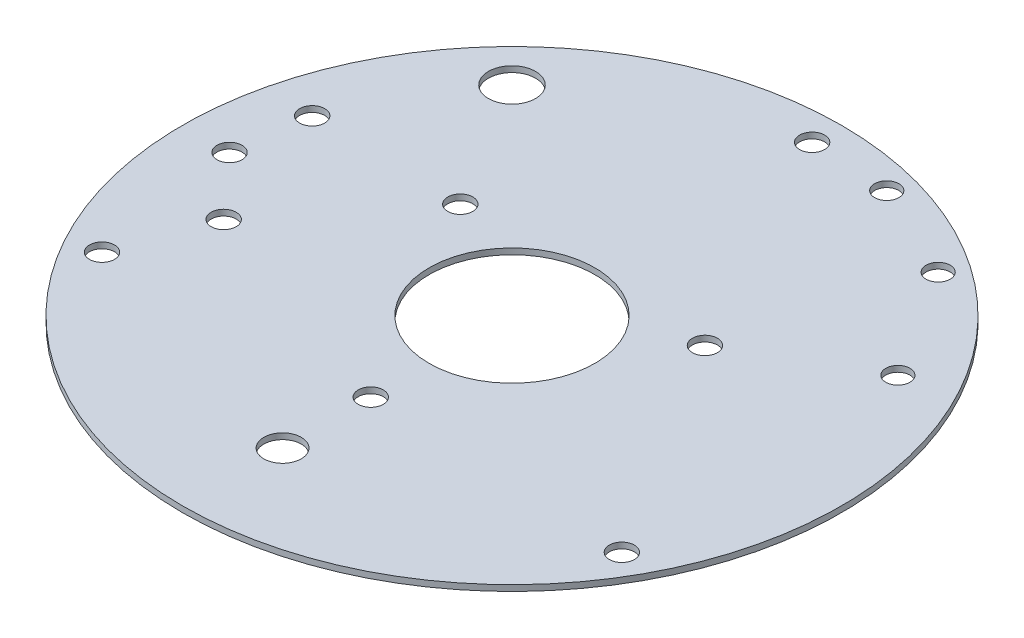
ISO-10303-21;
HEADER;
FILE_DESCRIPTION(('STEP AP214'),'2;1');
FILE_NAME('part.step','',(''),(''),'','','');
FILE_SCHEMA(('AUTOMOTIVE_DESIGN { 1 0 10303 214 1 1 1 1 }'));
ENDSEC;
DATA;
#1=APPLICATION_CONTEXT('core data for automotive mechanical design processes');
#2=APPLICATION_PROTOCOL_DEFINITION('international standard','automotive_design',2000,#1);
#3=PRODUCT_CONTEXT('',#1,'mechanical');
#4=PRODUCT('Part','Part','',(#3));
#5=PRODUCT_RELATED_PRODUCT_CATEGORY('part','',(#4));
#6=PRODUCT_DEFINITION_FORMATION('','',#4);
#7=PRODUCT_DEFINITION_CONTEXT('part definition',#1,'design');
#8=PRODUCT_DEFINITION('design','',#6,#7);
#9=PRODUCT_DEFINITION_SHAPE('','',#8);
#10=(LENGTH_UNIT() NAMED_UNIT(*) SI_UNIT(.MILLI.,.METRE.));
#11=(NAMED_UNIT(*) PLANE_ANGLE_UNIT() SI_UNIT($,.RADIAN.));
#12=(NAMED_UNIT(*) SI_UNIT($,.STERADIAN.) SOLID_ANGLE_UNIT());
#13=UNCERTAINTY_MEASURE_WITH_UNIT(LENGTH_MEASURE(1.E-05),#10,'distance_accuracy_value','');
#14=(GEOMETRIC_REPRESENTATION_CONTEXT(3) GLOBAL_UNCERTAINTY_ASSIGNED_CONTEXT((#13)) GLOBAL_UNIT_ASSIGNED_CONTEXT((#10,
#11,#12)) REPRESENTATION_CONTEXT('',''));
#15=CARTESIAN_POINT('',(0.,0.,0.));
#16=DIRECTION('',(0.,0.,1.));
#17=DIRECTION('',(1.,0.,0.));
#18=AXIS2_PLACEMENT_3D('',#15,#16,#17);
#19=CARTESIAN_POINT('',(0.,1.6002,0.));
#20=DIRECTION('',(0.,1.,0.));
#21=DIRECTION('',(0.,0.,1.));
#22=AXIS2_PLACEMENT_3D('',#19,#20,#21);
#23=PLANE('',#22);
#24=CARTESIAN_POINT('',(-32.995567884187,1.6002,-19.0500000000002));
#25=DIRECTION('',(0.,1.,0.));
#26=DIRECTION('',(0.,0.,1.));
#27=AXIS2_PLACEMENT_3D('',#24,#25,#26);
#28=CIRCLE('',#27,3.3782);
#29=CARTESIAN_POINT('',(-32.995567884187,1.6002,-15.6718000000002));
#30=VERTEX_POINT('',#29);
#31=EDGE_CURVE('E119',#30,#30,#28,.T.);
#32=ORIENTED_EDGE('',*,*,#31,.F.);
#33=EDGE_LOOP('',(#32));
#34=FACE_BOUND('',#33,.T.);
#35=CARTESIAN_POINT('',(70.1155817538974,1.6002,40.4812500000003));
#36=DIRECTION('',(0.,1.,0.));
#37=DIRECTION('',(0.,0.,1.));
#38=AXIS2_PLACEMENT_3D('',#35,#36,#37);
#39=CIRCLE('',#38,3.3782);
#40=CARTESIAN_POINT('',(70.1155817538974,1.6002,43.8594500000003));
#41=VERTEX_POINT('',#40);
#42=EDGE_CURVE('E107',#41,#41,#39,.T.);
#43=ORIENTED_EDGE('',*,*,#42,.F.);
#44=EDGE_LOOP('',(#43));
#45=FACE_BOUND('',#44,.T.);
#46=CARTESIAN_POINT('',(5.61311660465872E-12,1.6002,-80.962499999997));
#47=DIRECTION('',(0.,1.,0.));
#48=DIRECTION('',(0.,0.,1.));
#49=AXIS2_PLACEMENT_3D('',#46,#47,#48);
#50=CIRCLE('',#49,3.37819999999549);
#51=CARTESIAN_POINT('',(5.61311660465872E-12,1.6002,-77.5843000000015));
#52=VERTEX_POINT('',#51);
#53=EDGE_CURVE('E95',#52,#52,#50,.T.);
#54=ORIENTED_EDGE('',*,*,#53,.F.);
#55=EDGE_LOOP('',(#54));
#56=FACE_BOUND('',#55,.T.);
#57=CARTESIAN_POINT('',(47.3456,1.6002,-67.6148));
#58=DIRECTION('',(0.,1.,0.));
#59=DIRECTION('',(0.,0.,1.));
#60=AXIS2_PLACEMENT_3D('',#57,#58,#59);
#61=CIRCLE('',#60,3.2639);
#62=CARTESIAN_POINT('',(47.3456,1.6002,-64.3509));
#63=VERTEX_POINT('',#62);
#64=EDGE_CURVE('E83',#63,#63,#61,.T.);
#65=ORIENTED_EDGE('',*,*,#64,.F.);
#66=EDGE_LOOP('',(#65));
#67=FACE_BOUND('',#66,.T.);
#68=CARTESIAN_POINT('',(-73.6092,1.6002,-19.7104));
#69=DIRECTION('',(0.,1.,0.));
#70=DIRECTION('',(0.,0.,1.));
#71=AXIS2_PLACEMENT_3D('',#68,#69,#70);
#72=CIRCLE('',#71,3.37819999999999);
#73=CARTESIAN_POINT('',(-73.6092,1.6002,-16.3322));
#74=VERTEX_POINT('',#73);
#75=EDGE_CURVE('E71',#74,#74,#72,.T.);
#76=ORIENTED_EDGE('',*,*,#75,.F.);
#77=EDGE_LOOP('',(#76));
#78=FACE_BOUND('',#77,.T.);
#79=CARTESIAN_POINT('',(-61.341,1.6002,16.4338));
#80=DIRECTION('',(0.,1.,0.));
#81=DIRECTION('',(0.,0.,1.));
#82=AXIS2_PLACEMENT_3D('',#79,#80,#81);
#83=CIRCLE('',#82,3.37819999999999);
#84=CARTESIAN_POINT('',(-61.341,1.6002,19.812));
#85=VERTEX_POINT('',#84);
#86=EDGE_CURVE('E59',#85,#85,#83,.T.);
#87=ORIENTED_EDGE('',*,*,#86,.F.);
#88=EDGE_LOOP('',(#87));
#89=FACE_BOUND('',#88,.T.);
#90=CARTESIAN_POINT('',(-53.8734,1.6002,-53.8734));
#91=DIRECTION('',(0.,1.,0.));
#92=DIRECTION('',(0.,0.,1.));
#93=AXIS2_PLACEMENT_3D('',#90,#91,#92);
#94=CIRCLE('',#93,6.35);
#95=CARTESIAN_POINT('',(-53.8734,1.6002,-47.5234));
#96=VERTEX_POINT('',#95);
#97=EDGE_CURVE('E47',#96,#96,#94,.T.);
#98=ORIENTED_EDGE('',*,*,#97,.F.);
#99=EDGE_LOOP('',(#98));
#100=FACE_BOUND('',#99,.T.);
#101=CARTESIAN_POINT('',(0.,1.6002,0.));
#102=DIRECTION('',(0.,1.,0.));
#103=DIRECTION('',(0.,0.,1.));
#104=AXIS2_PLACEMENT_3D('',#101,#102,#103);
#105=CIRCLE('',#104,88.9);
#106=CARTESIAN_POINT('',(0.,1.6002,88.9));
#107=VERTEX_POINT('',#106);
#108=EDGE_CURVE('E10',#107,#107,#105,.T.);
#109=ORIENTED_EDGE('',*,*,#108,.T.);
#110=EDGE_LOOP('',(#109));
#111=FACE_BOUND('',#110,.T.);
#112=CARTESIAN_POINT('',(0.,1.6002,0.));
#113=DIRECTION('',(0.,1.,0.));
#114=DIRECTION('',(0.,0.,1.));
#115=AXIS2_PLACEMENT_3D('',#112,#113,#114);
#116=CIRCLE('',#115,22.352);
#117=CARTESIAN_POINT('',(0.,1.6002,22.352));
#118=VERTEX_POINT('',#117);
#119=EDGE_CURVE('E42',#118,#118,#116,.T.);
#120=ORIENTED_EDGE('',*,*,#119,.F.);
#121=EDGE_LOOP('',(#120));
#122=FACE_BOUND('',#121,.T.);
#123=CARTESIAN_POINT('',(0.,1.6002,61.8998));
#124=DIRECTION('',(0.,1.,0.));
#125=DIRECTION('',(0.,0.,1.));
#126=AXIS2_PLACEMENT_3D('',#123,#124,#125);
#127=CIRCLE('',#126,5.0419);
#128=CARTESIAN_POINT('',(0.,1.6002,66.9417));
#129=VERTEX_POINT('',#128);
#130=EDGE_CURVE('E53',#129,#129,#127,.T.);
#131=ORIENTED_EDGE('',*,*,#130,.F.);
#132=EDGE_LOOP('',(#131));
#133=FACE_BOUND('',#132,.T.);
#134=CARTESIAN_POINT('',(-76.2,1.6002,0.));
#135=DIRECTION('',(0.,1.,0.));
#136=DIRECTION('',(0.,0.,1.));
#137=AXIS2_PLACEMENT_3D('',#134,#135,#136);
#138=CIRCLE('',#137,3.37819999999999);
#139=CARTESIAN_POINT('',(-76.2,1.6002,3.37819999999999));
#140=VERTEX_POINT('',#139);
#141=EDGE_CURVE('E65',#140,#140,#138,.T.);
#142=ORIENTED_EDGE('',*,*,#141,.F.);
#143=EDGE_LOOP('',(#142));
#144=FACE_BOUND('',#143,.T.);
#145=CARTESIAN_POINT('',(65.9892,1.6002,-38.1));
#146=DIRECTION('',(0.,1.,0.));
#147=DIRECTION('',(0.,0.,1.));
#148=AXIS2_PLACEMENT_3D('',#145,#146,#147);
#149=CIRCLE('',#148,3.2639);
#150=CARTESIAN_POINT('',(65.9892,1.6002,-34.8361));
#151=VERTEX_POINT('',#150);
#152=EDGE_CURVE('E77',#151,#151,#149,.T.);
#153=ORIENTED_EDGE('',*,*,#152,.F.);
#154=EDGE_LOOP('',(#153));
#155=FACE_BOUND('',#154,.T.);
#156=CARTESIAN_POINT('',(21.3614,1.6002,-79.7306));
#157=DIRECTION('',(0.,1.,0.));
#158=DIRECTION('',(0.,0.,1.));
#159=AXIS2_PLACEMENT_3D('',#156,#157,#158);
#160=CIRCLE('',#159,3.2639);
#161=CARTESIAN_POINT('',(21.3614,1.6002,-76.4667));
#162=VERTEX_POINT('',#161);
#163=EDGE_CURVE('E89',#162,#162,#160,.T.);
#164=ORIENTED_EDGE('',*,*,#163,.F.);
#165=EDGE_LOOP('',(#164));
#166=FACE_BOUND('',#165,.T.);
#167=CARTESIAN_POINT('',(0.,1.6002,38.1));
#168=DIRECTION('',(0.,1.,0.));
#169=DIRECTION('',(0.,0.,1.));
#170=AXIS2_PLACEMENT_3D('',#167,#168,#169);
#171=CIRCLE('',#170,3.3782);
#172=CARTESIAN_POINT('',(0.,1.6002,41.4782));
#173=VERTEX_POINT('',#172);
#174=EDGE_CURVE('E101',#173,#173,#171,.T.);
#175=ORIENTED_EDGE('',*,*,#174,.F.);
#176=EDGE_LOOP('',(#175));
#177=FACE_BOUND('',#176,.T.);
#178=CARTESIAN_POINT('',(-70.1155817538927,1.6002,40.4812499999967));
#179=DIRECTION('',(0.,1.,0.));
#180=DIRECTION('',(0.,0.,1.));
#181=AXIS2_PLACEMENT_3D('',#178,#179,#180);
#182=CIRCLE('',#181,3.37820000000207);
#183=CARTESIAN_POINT('',(-70.1155817538927,1.6002,43.8594499999987));
#184=VERTEX_POINT('',#183);
#185=EDGE_CURVE('E113',#184,#184,#182,.T.);
#186=ORIENTED_EDGE('',*,*,#185,.F.);
#187=EDGE_LOOP('',(#186));
#188=FACE_BOUND('',#187,.T.);
#189=CARTESIAN_POINT('',(32.9955678841873,1.6002,-19.0499999999997));
#190=DIRECTION('',(0.,1.,0.));
#191=DIRECTION('',(0.,0.,1.));
#192=AXIS2_PLACEMENT_3D('',#189,#190,#191);
#193=CIRCLE('',#192,3.3782);
#194=CARTESIAN_POINT('',(32.9955678841873,1.6002,-15.6717999999997));
#195=VERTEX_POINT('',#194);
#196=EDGE_CURVE('E125',#195,#195,#193,.T.);
#197=ORIENTED_EDGE('',*,*,#196,.F.);
#198=EDGE_LOOP('',(#197));
#199=FACE_BOUND('',#198,.T.);
#200=ADVANCED_FACE('F31',(#34,#45,#56,#67,#78,#89,#100,#111,#122,#133,#144,#155,#166,#177,#188,
#199),#23,.T.);
#201=CARTESIAN_POINT('',(0.,0.,0.));
#202=DIRECTION('',(0.,1.,0.));
#203=DIRECTION('',(0.,0.,1.));
#204=AXIS2_PLACEMENT_3D('',#201,#202,#203);
#205=PLANE('',#204);
#206=CARTESIAN_POINT('',(0.,0.,0.));
#207=DIRECTION('',(0.,1.,0.));
#208=DIRECTION('',(0.,0.,1.));
#209=AXIS2_PLACEMENT_3D('',#206,#207,#208);
#210=CIRCLE('',#209,88.9);
#211=CARTESIAN_POINT('',(0.,0.,88.9));
#212=VERTEX_POINT('',#211);
#213=EDGE_CURVE('E35',#212,#212,#210,.T.);
#214=ORIENTED_EDGE('',*,*,#213,.F.);
#215=EDGE_LOOP('',(#214));
#216=FACE_BOUND('',#215,.T.);
#217=CARTESIAN_POINT('',(0.,0.,0.));
#218=DIRECTION('',(0.,1.,0.));
#219=DIRECTION('',(0.,0.,1.));
#220=AXIS2_PLACEMENT_3D('',#217,#218,#219);
#221=CIRCLE('',#220,22.352);
#222=CARTESIAN_POINT('',(0.,0.,22.352));
#223=VERTEX_POINT('',#222);
#224=EDGE_CURVE('E44',#223,#223,#221,.T.);
#225=ORIENTED_EDGE('',*,*,#224,.T.);
#226=EDGE_LOOP('',(#225));
#227=FACE_BOUND('',#226,.T.);
#228=CARTESIAN_POINT('',(-53.8734,0.,-53.8734));
#229=DIRECTION('',(0.,1.,0.));
#230=DIRECTION('',(0.,0.,1.));
#231=AXIS2_PLACEMENT_3D('',#228,#229,#230);
#232=CIRCLE('',#231,6.35);
#233=CARTESIAN_POINT('',(-53.8734,0.,-47.5234));
#234=VERTEX_POINT('',#233);
#235=EDGE_CURVE('E50',#234,#234,#232,.T.);
#236=ORIENTED_EDGE('',*,*,#235,.T.);
#237=EDGE_LOOP('',(#236));
#238=FACE_BOUND('',#237,.T.);
#239=CARTESIAN_POINT('',(0.,0.,61.8998));
#240=DIRECTION('',(0.,1.,0.));
#241=DIRECTION('',(0.,0.,1.));
#242=AXIS2_PLACEMENT_3D('',#239,#240,#241);
#243=CIRCLE('',#242,5.0419);
#244=CARTESIAN_POINT('',(0.,0.,66.9417));
#245=VERTEX_POINT('',#244);
#246=EDGE_CURVE('E56',#245,#245,#243,.T.);
#247=ORIENTED_EDGE('',*,*,#246,.T.);
#248=EDGE_LOOP('',(#247));
#249=FACE_BOUND('',#248,.T.);
#250=CARTESIAN_POINT('',(-61.341,0.,16.4338));
#251=DIRECTION('',(0.,1.,0.));
#252=DIRECTION('',(0.,0.,1.));
#253=AXIS2_PLACEMENT_3D('',#250,#251,#252);
#254=CIRCLE('',#253,3.37819999999999);
#255=CARTESIAN_POINT('',(-61.341,0.,19.812));
#256=VERTEX_POINT('',#255);
#257=EDGE_CURVE('E62',#256,#256,#254,.T.);
#258=ORIENTED_EDGE('',*,*,#257,.T.);
#259=EDGE_LOOP('',(#258));
#260=FACE_BOUND('',#259,.T.);
#261=CARTESIAN_POINT('',(-76.2,0.,0.));
#262=DIRECTION('',(0.,1.,0.));
#263=DIRECTION('',(0.,0.,1.));
#264=AXIS2_PLACEMENT_3D('',#261,#262,#263);
#265=CIRCLE('',#264,3.37819999999999);
#266=CARTESIAN_POINT('',(-76.2,0.,3.37819999999999));
#267=VERTEX_POINT('',#266);
#268=EDGE_CURVE('E68',#267,#267,#265,.T.);
#269=ORIENTED_EDGE('',*,*,#268,.T.);
#270=EDGE_LOOP('',(#269));
#271=FACE_BOUND('',#270,.T.);
#272=CARTESIAN_POINT('',(-73.6092,0.,-19.7104));
#273=DIRECTION('',(0.,1.,0.));
#274=DIRECTION('',(0.,0.,1.));
#275=AXIS2_PLACEMENT_3D('',#272,#273,#274);
#276=CIRCLE('',#275,3.37819999999999);
#277=CARTESIAN_POINT('',(-73.6092,0.,-16.3322));
#278=VERTEX_POINT('',#277);
#279=EDGE_CURVE('E74',#278,#278,#276,.T.);
#280=ORIENTED_EDGE('',*,*,#279,.T.);
#281=EDGE_LOOP('',(#280));
#282=FACE_BOUND('',#281,.T.);
#283=CARTESIAN_POINT('',(65.9892,0.,-38.1));
#284=DIRECTION('',(0.,1.,0.));
#285=DIRECTION('',(0.,0.,1.));
#286=AXIS2_PLACEMENT_3D('',#283,#284,#285);
#287=CIRCLE('',#286,3.2639);
#288=CARTESIAN_POINT('',(65.9892,0.,-34.8361));
#289=VERTEX_POINT('',#288);
#290=EDGE_CURVE('E80',#289,#289,#287,.T.);
#291=ORIENTED_EDGE('',*,*,#290,.T.);
#292=EDGE_LOOP('',(#291));
#293=FACE_BOUND('',#292,.T.);
#294=CARTESIAN_POINT('',(47.3456,0.,-67.6148));
#295=DIRECTION('',(0.,1.,0.));
#296=DIRECTION('',(0.,0.,1.));
#297=AXIS2_PLACEMENT_3D('',#294,#295,#296);
#298=CIRCLE('',#297,3.2639);
#299=CARTESIAN_POINT('',(47.3456,0.,-64.3509));
#300=VERTEX_POINT('',#299);
#301=EDGE_CURVE('E86',#300,#300,#298,.T.);
#302=ORIENTED_EDGE('',*,*,#301,.T.);
#303=EDGE_LOOP('',(#302));
#304=FACE_BOUND('',#303,.T.);
#305=CARTESIAN_POINT('',(21.3614,0.,-79.7306));
#306=DIRECTION('',(0.,1.,0.));
#307=DIRECTION('',(0.,0.,1.));
#308=AXIS2_PLACEMENT_3D('',#305,#306,#307);
#309=CIRCLE('',#308,3.2639);
#310=CARTESIAN_POINT('',(21.3614,0.,-76.4667));
#311=VERTEX_POINT('',#310);
#312=EDGE_CURVE('E92',#311,#311,#309,.T.);
#313=ORIENTED_EDGE('',*,*,#312,.T.);
#314=EDGE_LOOP('',(#313));
#315=FACE_BOUND('',#314,.T.);
#316=CARTESIAN_POINT('',(5.61311660465872E-12,0.,-80.962499999997));
#317=DIRECTION('',(0.,1.,0.));
#318=DIRECTION('',(0.,0.,1.));
#319=AXIS2_PLACEMENT_3D('',#316,#317,#318);
#320=CIRCLE('',#319,3.37819999999549);
#321=CARTESIAN_POINT('',(5.61311660465872E-12,0.,-77.5843000000015));
#322=VERTEX_POINT('',#321);
#323=EDGE_CURVE('E98',#322,#322,#320,.T.);
#324=ORIENTED_EDGE('',*,*,#323,.T.);
#325=EDGE_LOOP('',(#324));
#326=FACE_BOUND('',#325,.T.);
#327=CARTESIAN_POINT('',(0.,0.,38.1));
#328=DIRECTION('',(0.,1.,0.));
#329=DIRECTION('',(0.,0.,1.));
#330=AXIS2_PLACEMENT_3D('',#327,#328,#329);
#331=CIRCLE('',#330,3.3782);
#332=CARTESIAN_POINT('',(0.,0.,41.4782));
#333=VERTEX_POINT('',#332);
#334=EDGE_CURVE('E104',#333,#333,#331,.T.);
#335=ORIENTED_EDGE('',*,*,#334,.T.);
#336=EDGE_LOOP('',(#335));
#337=FACE_BOUND('',#336,.T.);
#338=CARTESIAN_POINT('',(70.1155817538974,0.,40.4812500000003));
#339=DIRECTION('',(0.,1.,0.));
#340=DIRECTION('',(0.,0.,1.));
#341=AXIS2_PLACEMENT_3D('',#338,#339,#340);
#342=CIRCLE('',#341,3.3782);
#343=CARTESIAN_POINT('',(70.1155817538974,0.,43.8594500000003));
#344=VERTEX_POINT('',#343);
#345=EDGE_CURVE('E110',#344,#344,#342,.T.);
#346=ORIENTED_EDGE('',*,*,#345,.T.);
#347=EDGE_LOOP('',(#346));
#348=FACE_BOUND('',#347,.T.);
#349=CARTESIAN_POINT('',(-70.1155817538927,0.,40.4812499999967));
#350=DIRECTION('',(0.,1.,0.));
#351=DIRECTION('',(0.,0.,1.));
#352=AXIS2_PLACEMENT_3D('',#349,#350,#351);
#353=CIRCLE('',#352,3.37820000000207);
#354=CARTESIAN_POINT('',(-70.1155817538927,0.,43.8594499999987));
#355=VERTEX_POINT('',#354);
#356=EDGE_CURVE('E116',#355,#355,#353,.T.);
#357=ORIENTED_EDGE('',*,*,#356,.T.);
#358=EDGE_LOOP('',(#357));
#359=FACE_BOUND('',#358,.T.);
#360=CARTESIAN_POINT('',(-32.995567884187,0.,-19.0500000000002));
#361=DIRECTION('',(0.,1.,0.));
#362=DIRECTION('',(0.,0.,1.));
#363=AXIS2_PLACEMENT_3D('',#360,#361,#362);
#364=CIRCLE('',#363,3.3782);
#365=CARTESIAN_POINT('',(-32.995567884187,0.,-15.6718000000002));
#366=VERTEX_POINT('',#365);
#367=EDGE_CURVE('E122',#366,#366,#364,.T.);
#368=ORIENTED_EDGE('',*,*,#367,.T.);
#369=EDGE_LOOP('',(#368));
#370=FACE_BOUND('',#369,.T.);
#371=CARTESIAN_POINT('',(32.9955678841873,0.,-19.0499999999997));
#372=DIRECTION('',(0.,1.,0.));
#373=DIRECTION('',(0.,0.,1.));
#374=AXIS2_PLACEMENT_3D('',#371,#372,#373);
#375=CIRCLE('',#374,3.3782);
#376=CARTESIAN_POINT('',(32.9955678841873,0.,-15.6717999999997));
#377=VERTEX_POINT('',#376);
#378=EDGE_CURVE('E128',#377,#377,#375,.T.);
#379=ORIENTED_EDGE('',*,*,#378,.T.);
#380=EDGE_LOOP('',(#379));
#381=FACE_BOUND('',#380,.T.);
#382=ADVANCED_FACE('F138',(#216,#227,#238,#249,#260,#271,#282,#293,#304,#315,#326,#337,#348,
#359,#370,#381),#205,.F.);
#383=CARTESIAN_POINT('',(0.,1.6002,0.));
#384=DIRECTION('',(0.,-1.,0.));
#385=DIRECTION('',(0.,0.,-1.));
#386=AXIS2_PLACEMENT_3D('',#383,#384,#385);
#387=CYLINDRICAL_SURFACE('',#386,88.9);
#388=ORIENTED_EDGE('',*,*,#108,.F.);
#389=EDGE_LOOP('',(#388));
#390=FACE_BOUND('',#389,.T.);
#391=ORIENTED_EDGE('',*,*,#213,.T.);
#392=EDGE_LOOP('',(#391));
#393=FACE_BOUND('',#392,.T.);
#394=ADVANCED_FACE('F33',(#390,#393),#387,.T.);
#395=CARTESIAN_POINT('',(0.,1.6002,0.));
#396=DIRECTION('',(0.,-1.,0.));
#397=DIRECTION('',(0.,0.,-1.));
#398=AXIS2_PLACEMENT_3D('',#395,#396,#397);
#399=CYLINDRICAL_SURFACE('',#398,22.352);
#400=ORIENTED_EDGE('',*,*,#119,.T.);
#401=EDGE_LOOP('',(#400));
#402=FACE_BOUND('',#401,.T.);
#403=ORIENTED_EDGE('',*,*,#224,.F.);
#404=EDGE_LOOP('',(#403));
#405=FACE_BOUND('',#404,.T.);
#406=ADVANCED_FACE('F148',(#402,#405),#399,.F.);
#407=CARTESIAN_POINT('',(-53.8734,1.6002,-53.8734));
#408=DIRECTION('',(0.,-1.,0.));
#409=DIRECTION('',(0.,0.,-1.));
#410=AXIS2_PLACEMENT_3D('',#407,#408,#409);
#411=CYLINDRICAL_SURFACE('',#410,6.35);
#412=ORIENTED_EDGE('',*,*,#97,.T.);
#413=EDGE_LOOP('',(#412));
#414=FACE_BOUND('',#413,.T.);
#415=ORIENTED_EDGE('',*,*,#235,.F.);
#416=EDGE_LOOP('',(#415));
#417=FACE_BOUND('',#416,.T.);
#418=ADVANCED_FACE('F151',(#414,#417),#411,.F.);
#419=CARTESIAN_POINT('',(0.,1.6002,61.8998));
#420=DIRECTION('',(0.,-1.,0.));
#421=DIRECTION('',(0.,0.,-1.));
#422=AXIS2_PLACEMENT_3D('',#419,#420,#421);
#423=CYLINDRICAL_SURFACE('',#422,5.0419);
#424=ORIENTED_EDGE('',*,*,#130,.T.);
#425=EDGE_LOOP('',(#424));
#426=FACE_BOUND('',#425,.T.);
#427=ORIENTED_EDGE('',*,*,#246,.F.);
#428=EDGE_LOOP('',(#427));
#429=FACE_BOUND('',#428,.T.);
#430=ADVANCED_FACE('F155',(#426,#429),#423,.F.);
#431=CARTESIAN_POINT('',(-61.341,1.6002,16.4338));
#432=DIRECTION('',(0.,-1.,0.));
#433=DIRECTION('',(0.,0.,-1.));
#434=AXIS2_PLACEMENT_3D('',#431,#432,#433);
#435=CYLINDRICAL_SURFACE('',#434,3.37819999999999);
#436=ORIENTED_EDGE('',*,*,#86,.T.);
#437=EDGE_LOOP('',(#436));
#438=FACE_BOUND('',#437,.T.);
#439=ORIENTED_EDGE('',*,*,#257,.F.);
#440=EDGE_LOOP('',(#439));
#441=FACE_BOUND('',#440,.T.);
#442=ADVANCED_FACE('F159',(#438,#441),#435,.F.);
#443=CARTESIAN_POINT('',(-76.2,1.6002,0.));
#444=DIRECTION('',(0.,-1.,0.));
#445=DIRECTION('',(0.,0.,-1.));
#446=AXIS2_PLACEMENT_3D('',#443,#444,#445);
#447=CYLINDRICAL_SURFACE('',#446,3.37819999999999);
#448=ORIENTED_EDGE('',*,*,#141,.T.);
#449=EDGE_LOOP('',(#448));
#450=FACE_BOUND('',#449,.T.);
#451=ORIENTED_EDGE('',*,*,#268,.F.);
#452=EDGE_LOOP('',(#451));
#453=FACE_BOUND('',#452,.T.);
#454=ADVANCED_FACE('F163',(#450,#453),#447,.F.);
#455=CARTESIAN_POINT('',(-73.6092,1.6002,-19.7104));
#456=DIRECTION('',(0.,-1.,0.));
#457=DIRECTION('',(0.,0.,-1.));
#458=AXIS2_PLACEMENT_3D('',#455,#456,#457);
#459=CYLINDRICAL_SURFACE('',#458,3.37819999999999);
#460=ORIENTED_EDGE('',*,*,#75,.T.);
#461=EDGE_LOOP('',(#460));
#462=FACE_BOUND('',#461,.T.);
#463=ORIENTED_EDGE('',*,*,#279,.F.);
#464=EDGE_LOOP('',(#463));
#465=FACE_BOUND('',#464,.T.);
#466=ADVANCED_FACE('F167',(#462,#465),#459,.F.);
#467=CARTESIAN_POINT('',(65.9892,1.6002,-38.1));
#468=DIRECTION('',(0.,-1.,0.));
#469=DIRECTION('',(0.,0.,-1.));
#470=AXIS2_PLACEMENT_3D('',#467,#468,#469);
#471=CYLINDRICAL_SURFACE('',#470,3.2639);
#472=ORIENTED_EDGE('',*,*,#152,.T.);
#473=EDGE_LOOP('',(#472));
#474=FACE_BOUND('',#473,.T.);
#475=ORIENTED_EDGE('',*,*,#290,.F.);
#476=EDGE_LOOP('',(#475));
#477=FACE_BOUND('',#476,.T.);
#478=ADVANCED_FACE('F171',(#474,#477),#471,.F.);
#479=CARTESIAN_POINT('',(47.3456,1.6002,-67.6148));
#480=DIRECTION('',(0.,-1.,0.));
#481=DIRECTION('',(0.,0.,-1.));
#482=AXIS2_PLACEMENT_3D('',#479,#480,#481);
#483=CYLINDRICAL_SURFACE('',#482,3.2639);
#484=ORIENTED_EDGE('',*,*,#64,.T.);
#485=EDGE_LOOP('',(#484));
#486=FACE_BOUND('',#485,.T.);
#487=ORIENTED_EDGE('',*,*,#301,.F.);
#488=EDGE_LOOP('',(#487));
#489=FACE_BOUND('',#488,.T.);
#490=ADVANCED_FACE('F175',(#486,#489),#483,.F.);
#491=CARTESIAN_POINT('',(21.3614,1.6002,-79.7306));
#492=DIRECTION('',(0.,-1.,0.));
#493=DIRECTION('',(0.,0.,-1.));
#494=AXIS2_PLACEMENT_3D('',#491,#492,#493);
#495=CYLINDRICAL_SURFACE('',#494,3.2639);
#496=ORIENTED_EDGE('',*,*,#163,.T.);
#497=EDGE_LOOP('',(#496));
#498=FACE_BOUND('',#497,.T.);
#499=ORIENTED_EDGE('',*,*,#312,.F.);
#500=EDGE_LOOP('',(#499));
#501=FACE_BOUND('',#500,.T.);
#502=ADVANCED_FACE('F179',(#498,#501),#495,.F.);
#503=CARTESIAN_POINT('',(5.61311660465872E-12,1.6002,-80.962499999997));
#504=DIRECTION('',(0.,-1.,0.));
#505=DIRECTION('',(0.,0.,-1.));
#506=AXIS2_PLACEMENT_3D('',#503,#504,#505);
#507=CYLINDRICAL_SURFACE('',#506,3.37819999999549);
#508=ORIENTED_EDGE('',*,*,#53,.T.);
#509=EDGE_LOOP('',(#508));
#510=FACE_BOUND('',#509,.T.);
#511=ORIENTED_EDGE('',*,*,#323,.F.);
#512=EDGE_LOOP('',(#511));
#513=FACE_BOUND('',#512,.T.);
#514=ADVANCED_FACE('F183',(#510,#513),#507,.F.);
#515=CARTESIAN_POINT('',(0.,1.6002,38.1));
#516=DIRECTION('',(0.,-1.,0.));
#517=DIRECTION('',(0.,0.,-1.));
#518=AXIS2_PLACEMENT_3D('',#515,#516,#517);
#519=CYLINDRICAL_SURFACE('',#518,3.3782);
#520=ORIENTED_EDGE('',*,*,#174,.T.);
#521=EDGE_LOOP('',(#520));
#522=FACE_BOUND('',#521,.T.);
#523=ORIENTED_EDGE('',*,*,#334,.F.);
#524=EDGE_LOOP('',(#523));
#525=FACE_BOUND('',#524,.T.);
#526=ADVANCED_FACE('F187',(#522,#525),#519,.F.);
#527=CARTESIAN_POINT('',(70.1155817538974,1.6002,40.4812500000003));
#528=DIRECTION('',(0.,-1.,0.));
#529=DIRECTION('',(0.,0.,-1.));
#530=AXIS2_PLACEMENT_3D('',#527,#528,#529);
#531=CYLINDRICAL_SURFACE('',#530,3.3782);
#532=ORIENTED_EDGE('',*,*,#42,.T.);
#533=EDGE_LOOP('',(#532));
#534=FACE_BOUND('',#533,.T.);
#535=ORIENTED_EDGE('',*,*,#345,.F.);
#536=EDGE_LOOP('',(#535));
#537=FACE_BOUND('',#536,.T.);
#538=ADVANCED_FACE('F191',(#534,#537),#531,.F.);
#539=CARTESIAN_POINT('',(-70.1155817538927,1.6002,40.4812499999967));
#540=DIRECTION('',(0.,-1.,0.));
#541=DIRECTION('',(0.,0.,-1.));
#542=AXIS2_PLACEMENT_3D('',#539,#540,#541);
#543=CYLINDRICAL_SURFACE('',#542,3.37820000000207);
#544=ORIENTED_EDGE('',*,*,#185,.T.);
#545=EDGE_LOOP('',(#544));
#546=FACE_BOUND('',#545,.T.);
#547=ORIENTED_EDGE('',*,*,#356,.F.);
#548=EDGE_LOOP('',(#547));
#549=FACE_BOUND('',#548,.T.);
#550=ADVANCED_FACE('F195',(#546,#549),#543,.F.);
#551=CARTESIAN_POINT('',(-32.995567884187,1.6002,-19.0500000000002));
#552=DIRECTION('',(0.,-1.,0.));
#553=DIRECTION('',(0.,0.,-1.));
#554=AXIS2_PLACEMENT_3D('',#551,#552,#553);
#555=CYLINDRICAL_SURFACE('',#554,3.3782);
#556=ORIENTED_EDGE('',*,*,#31,.T.);
#557=EDGE_LOOP('',(#556));
#558=FACE_BOUND('',#557,.T.);
#559=ORIENTED_EDGE('',*,*,#367,.F.);
#560=EDGE_LOOP('',(#559));
#561=FACE_BOUND('',#560,.T.);
#562=ADVANCED_FACE('F199',(#558,#561),#555,.F.);
#563=CARTESIAN_POINT('',(32.9955678841873,1.6002,-19.0499999999997));
#564=DIRECTION('',(0.,-1.,0.));
#565=DIRECTION('',(0.,0.,-1.));
#566=AXIS2_PLACEMENT_3D('',#563,#564,#565);
#567=CYLINDRICAL_SURFACE('',#566,3.3782);
#568=ORIENTED_EDGE('',*,*,#196,.T.);
#569=EDGE_LOOP('',(#568));
#570=FACE_BOUND('',#569,.T.);
#571=ORIENTED_EDGE('',*,*,#378,.F.);
#572=EDGE_LOOP('',(#571));
#573=FACE_BOUND('',#572,.T.);
#574=ADVANCED_FACE('F134',(#570,#573),#567,.F.);
#575=CLOSED_SHELL('',(#200,#382,#394,#406,#418,#430,#442,#454,#466,#478,#490,#502,#514,#526,
#538,#550,#562,#574));
#576=MANIFOLD_SOLID_BREP('B2',#575);
#577=ADVANCED_BREP_SHAPE_REPRESENTATION('',(#18,#576),#14);
#578=SHAPE_DEFINITION_REPRESENTATION(#9,#577);
ENDSEC;
END-ISO-10303-21;
